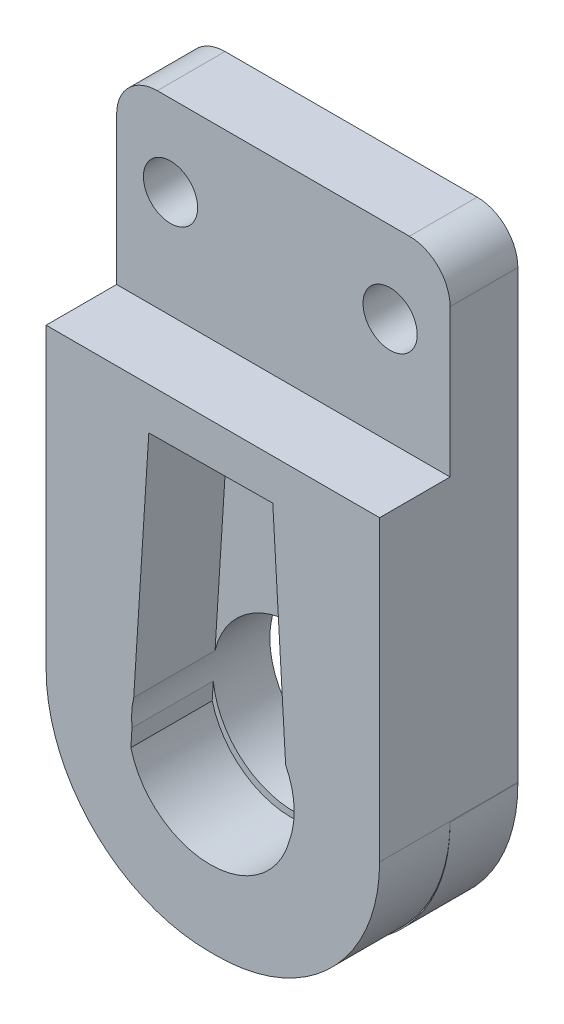
ISO-10303-21;
HEADER;
FILE_DESCRIPTION(('STEP AP214'),'2;1');
FILE_NAME('part.step','',(''),(''),'','','');
FILE_SCHEMA(('AUTOMOTIVE_DESIGN { 1 0 10303 214 1 1 1 1 }'));
ENDSEC;
DATA;
#1=APPLICATION_CONTEXT('core data for automotive mechanical design processes');
#2=APPLICATION_PROTOCOL_DEFINITION('international standard','automotive_design',2000,#1);
#3=PRODUCT_CONTEXT('',#1,'mechanical');
#4=PRODUCT('Part','Part','',(#3));
#5=PRODUCT_RELATED_PRODUCT_CATEGORY('part','',(#4));
#6=PRODUCT_DEFINITION_FORMATION('','',#4);
#7=PRODUCT_DEFINITION_CONTEXT('part definition',#1,'design');
#8=PRODUCT_DEFINITION('design','',#6,#7);
#9=PRODUCT_DEFINITION_SHAPE('','',#8);
#10=(LENGTH_UNIT() NAMED_UNIT(*) SI_UNIT(.MILLI.,.METRE.));
#11=(NAMED_UNIT(*) PLANE_ANGLE_UNIT() SI_UNIT($,.RADIAN.));
#12=(NAMED_UNIT(*) SI_UNIT($,.STERADIAN.) SOLID_ANGLE_UNIT());
#13=UNCERTAINTY_MEASURE_WITH_UNIT(LENGTH_MEASURE(1.E-05),#10,'distance_accuracy_value','');
#14=(GEOMETRIC_REPRESENTATION_CONTEXT(3) GLOBAL_UNCERTAINTY_ASSIGNED_CONTEXT((#13)) GLOBAL_UNIT_ASSIGNED_CONTEXT((#10,
#11,#12)) REPRESENTATION_CONTEXT('',''));
#15=CARTESIAN_POINT('',(0.,0.,0.));
#16=DIRECTION('',(0.,0.,1.));
#17=DIRECTION('',(1.,0.,0.));
#18=AXIS2_PLACEMENT_3D('',#15,#16,#17);
#19=CARTESIAN_POINT('',(0.,0.,12.5));
#20=DIRECTION('',(0.,0.,1.));
#21=DIRECTION('',(1.,0.,0.));
#22=AXIS2_PLACEMENT_3D('',#19,#20,#21);
#23=PLANE('',#22);
#24=DIRECTION('',(-1.,0.,0.));
#25=VECTOR('',#24,1.);
#26=CARTESIAN_POINT('',(-326.037234808109,233.422697823661,12.5));
#27=LINE('',#26,#25);
#28=CARTESIAN_POINT('',(-313.737234808109,233.422697823661,12.5));
#29=VERTEX_POINT('',#28);
#30=CARTESIAN_POINT('',(-326.037234808109,233.422697823661,12.5));
#31=VERTEX_POINT('',#30);
#32=EDGE_CURVE('E248',#29,#31,#27,.T.);
#33=ORIENTED_EDGE('',*,*,#32,.F.);
#34=DIRECTION('',(0.,1.,0.));
#35=VECTOR('',#34,1.);
#36=CARTESIAN_POINT('',(-313.737234808109,240.363656002817,12.5));
#37=LINE('',#36,#35);
#38=CARTESIAN_POINT('',(-313.737234808109,238.863656002817,12.5));
#39=VERTEX_POINT('',#38);
#40=EDGE_CURVE('E300',#29,#39,#37,.T.);
#41=ORIENTED_EDGE('',*,*,#40,.T.);
#42=CARTESIAN_POINT('',(-315.237234808109,238.863656002817,12.5));
#43=DIRECTION('',(0.,0.,1.));
#44=DIRECTION('',(1.,0.,0.));
#45=AXIS2_PLACEMENT_3D('',#42,#43,#44);
#46=CIRCLE('',#45,1.5);
#47=CARTESIAN_POINT('',(-315.237234808109,240.363656002817,12.5));
#48=VERTEX_POINT('',#47);
#49=EDGE_CURVE('E357',#39,#48,#46,.T.);
#50=ORIENTED_EDGE('',*,*,#49,.T.);
#51=DIRECTION('',(-1.,0.,0.));
#52=VECTOR('',#51,1.);
#53=CARTESIAN_POINT('',(-326.037234808109,240.363656002817,12.5));
#54=LINE('',#53,#52);
#55=CARTESIAN_POINT('',(-324.537234808109,240.363656002817,12.5));
#56=VERTEX_POINT('',#55);
#57=EDGE_CURVE('E303',#48,#56,#54,.T.);
#58=ORIENTED_EDGE('',*,*,#57,.T.);
#59=CARTESIAN_POINT('',(-324.537234808109,238.863656002817,12.5));
#60=DIRECTION('',(0.,0.,1.));
#61=DIRECTION('',(1.,0.,0.));
#62=AXIS2_PLACEMENT_3D('',#59,#60,#61);
#63=CIRCLE('',#62,1.5);
#64=CARTESIAN_POINT('',(-326.037234808109,238.863656002817,12.5));
#65=VERTEX_POINT('',#64);
#66=EDGE_CURVE('E360',#56,#65,#63,.T.);
#67=ORIENTED_EDGE('',*,*,#66,.T.);
#68=DIRECTION('',(0.,-1.,0.));
#69=VECTOR('',#68,1.);
#70=CARTESIAN_POINT('',(-326.037234808109,240.363656002817,12.5));
#71=LINE('',#70,#69);
#72=EDGE_CURVE('E293',#65,#31,#71,.T.);
#73=ORIENTED_EDGE('',*,*,#72,.T.);
#74=EDGE_LOOP('',(#33,#41,#50,#58,#67,#73));
#75=FACE_BOUND('',#74,.T.);
#76=CARTESIAN_POINT('',(-324.049090595756,237.363656002817,12.5));
#77=DIRECTION('',(0.,0.,1.));
#78=DIRECTION('',(1.,0.,0.));
#79=AXIS2_PLACEMENT_3D('',#76,#77,#78);
#80=CIRCLE('',#79,0.999999999999998);
#81=CARTESIAN_POINT('',(-323.049090595756,237.363656002817,12.5));
#82=VERTEX_POINT('',#81);
#83=EDGE_CURVE('E285',#82,#82,#80,.T.);
#84=ORIENTED_EDGE('',*,*,#83,.F.);
#85=EDGE_LOOP('',(#84));
#86=FACE_BOUND('',#85,.T.);
#87=CARTESIAN_POINT('',(-315.949090595756,237.363656002817,12.5));
#88=DIRECTION('',(0.,0.,1.));
#89=DIRECTION('',(1.,0.,0.));
#90=AXIS2_PLACEMENT_3D('',#87,#88,#89);
#91=CIRCLE('',#90,0.999999999999998);
#92=CARTESIAN_POINT('',(-314.949090595756,237.363656002817,12.5));
#93=VERTEX_POINT('',#92);
#94=EDGE_CURVE('E284',#93,#93,#91,.T.);
#95=ORIENTED_EDGE('',*,*,#94,.F.);
#96=EDGE_LOOP('',(#95));
#97=FACE_BOUND('',#96,.T.);
#98=ADVANCED_FACE('F41',(#75,#86,#97),#23,.T.);
#99=CARTESIAN_POINT('',(-326.037234808109,240.363656002817,12.5));
#100=DIRECTION('',(1.,0.,0.));
#101=DIRECTION('',(0.,0.,-1.));
#102=AXIS2_PLACEMENT_3D('',#99,#100,#101);
#103=PLANE('',#102);
#104=DIRECTION('',(0.,-1.,0.));
#105=VECTOR('',#104,1.);
#106=CARTESIAN_POINT('',(-326.037234808109,240.363656002817,10.));
#107=LINE('',#106,#105);
#108=CARTESIAN_POINT('',(-326.037234808109,238.863656002817,10.));
#109=VERTEX_POINT('',#108);
#110=CARTESIAN_POINT('',(-326.037234808109,222.422697823661,10.));
#111=VERTEX_POINT('',#110);
#112=EDGE_CURVE('E308',#109,#111,#107,.T.);
#113=ORIENTED_EDGE('',*,*,#112,.T.);
#114=DIRECTION('',(0.,0.,-1.));
#115=VECTOR('',#114,1.);
#116=CARTESIAN_POINT('',(-326.037234808109,222.422697823661,12.5));
#117=LINE('',#116,#115);
#118=CARTESIAN_POINT('',(-326.037234808109,222.422697823661,15.1));
#119=VERTEX_POINT('',#118);
#120=EDGE_CURVE('E399',#111,#119,#117,.F.);
#121=ORIENTED_EDGE('',*,*,#120,.T.);
#122=DIRECTION('',(0.,-1.,0.));
#123=VECTOR('',#122,1.);
#124=CARTESIAN_POINT('',(-326.037234808109,233.422697823661,15.1));
#125=LINE('',#124,#123);
#126=CARTESIAN_POINT('',(-326.037234808109,233.422697823661,15.1));
#127=VERTEX_POINT('',#126);
#128=EDGE_CURVE('E253',#127,#119,#125,.T.);
#129=ORIENTED_EDGE('',*,*,#128,.F.);
#130=DIRECTION('',(0.,0.,-1.));
#131=VECTOR('',#130,1.);
#132=CARTESIAN_POINT('',(-326.037234808109,233.422697823661,15.1));
#133=LINE('',#132,#131);
#134=EDGE_CURVE('E267',#127,#31,#133,.T.);
#135=ORIENTED_EDGE('',*,*,#134,.T.);
#136=ORIENTED_EDGE('',*,*,#72,.F.);
#137=DIRECTION('',(0.,0.,-1.));
#138=VECTOR('',#137,1.);
#139=CARTESIAN_POINT('',(-326.037234808109,238.863656002817,12.5));
#140=LINE('',#139,#138);
#141=EDGE_CURVE('E339',#65,#109,#140,.T.);
#142=ORIENTED_EDGE('',*,*,#141,.T.);
#143=EDGE_LOOP('',(#113,#121,#129,#135,#136,#142));
#144=FACE_BOUND('',#143,.T.);
#145=ADVANCED_FACE('F459',(#144),#103,.F.);
#146=CARTESIAN_POINT('',(-326.037234808109,216.363656002817,12.5));
#147=DIRECTION('',(0.,1.,0.));
#148=DIRECTION('',(0.,0.,1.));
#149=AXIS2_PLACEMENT_3D('',#146,#147,#148);
#150=PLANE('',#149);
#151=DIRECTION('',(1.,0.,0.));
#152=VECTOR('',#151,1.);
#153=CARTESIAN_POINT('',(-326.037234808109,216.363656002817,10.));
#154=LINE('',#153,#152);
#155=CARTESIAN_POINT('',(-320.037234808109,216.363656002817,10.));
#156=VERTEX_POINT('',#155);
#157=CARTESIAN_POINT('',(-319.737234808108,216.363656002817,10.));
#158=VERTEX_POINT('',#157);
#159=EDGE_CURVE('E312',#156,#158,#154,.T.);
#160=ORIENTED_EDGE('',*,*,#159,.T.);
#161=DIRECTION('',(0.,0.,-1.));
#162=VECTOR('',#161,1.);
#163=CARTESIAN_POINT('',(-319.737234808108,216.363656002817,12.5));
#164=LINE('',#163,#162);
#165=CARTESIAN_POINT('',(-319.737234808108,216.363656002817,12.5));
#166=VERTEX_POINT('',#165);
#167=EDGE_CURVE('E332',#158,#166,#164,.F.);
#168=ORIENTED_EDGE('',*,*,#167,.T.);
#169=DIRECTION('',(1.,0.,0.));
#170=VECTOR('',#169,1.);
#171=CARTESIAN_POINT('',(-326.037234808109,216.363656002817,12.5));
#172=LINE('',#171,#170);
#173=CARTESIAN_POINT('',(-320.037234808109,216.363656002817,12.5));
#174=VERTEX_POINT('',#173);
#175=EDGE_CURVE('E296',#174,#166,#172,.T.);
#176=ORIENTED_EDGE('',*,*,#175,.F.);
#177=DIRECTION('',(0.,0.,-1.));
#178=VECTOR('',#177,1.);
#179=CARTESIAN_POINT('',(-320.037234808109,216.363656002817,12.5));
#180=LINE('',#179,#178);
#181=EDGE_CURVE('E328',#174,#156,#180,.T.);
#182=ORIENTED_EDGE('',*,*,#181,.T.);
#183=EDGE_LOOP('',(#160,#168,#176,#182));
#184=FACE_BOUND('',#183,.T.);
#185=ADVANCED_FACE('F440',(#184),#150,.F.);
#186=CARTESIAN_POINT('',(-313.737234808109,240.363656002817,12.5));
#187=DIRECTION('',(-1.,0.,0.));
#188=DIRECTION('',(0.,-1.,0.));
#189=AXIS2_PLACEMENT_3D('',#186,#187,#188);
#190=PLANE('',#189);
#191=DIRECTION('',(0.,1.,0.));
#192=VECTOR('',#191,1.);
#193=CARTESIAN_POINT('',(-313.737234808109,233.422697823661,15.1));
#194=LINE('',#193,#192);
#195=CARTESIAN_POINT('',(-313.737234808109,222.422697823661,15.1));
#196=VERTEX_POINT('',#195);
#197=CARTESIAN_POINT('',(-313.737234808109,233.422697823661,15.1));
#198=VERTEX_POINT('',#197);
#199=EDGE_CURVE('E261',#196,#198,#194,.T.);
#200=ORIENTED_EDGE('',*,*,#199,.F.);
#201=DIRECTION('',(0.,0.,-1.));
#202=VECTOR('',#201,1.);
#203=CARTESIAN_POINT('',(-313.737234808108,222.422697823661,12.5));
#204=LINE('',#203,#202);
#205=CARTESIAN_POINT('',(-313.737234808108,222.422697823661,10.));
#206=VERTEX_POINT('',#205);
#207=EDGE_CURVE('E408',#196,#206,#204,.T.);
#208=ORIENTED_EDGE('',*,*,#207,.T.);
#209=DIRECTION('',(0.,1.,0.));
#210=VECTOR('',#209,1.);
#211=CARTESIAN_POINT('',(-313.737234808109,240.363656002817,10.));
#212=LINE('',#211,#210);
#213=CARTESIAN_POINT('',(-313.737234808109,238.863656002817,10.));
#214=VERTEX_POINT('',#213);
#215=EDGE_CURVE('E317',#206,#214,#212,.T.);
#216=ORIENTED_EDGE('',*,*,#215,.T.);
#217=DIRECTION('',(0.,0.,-1.));
#218=VECTOR('',#217,1.);
#219=CARTESIAN_POINT('',(-313.737234808109,238.863656002817,12.5));
#220=LINE('',#219,#218);
#221=EDGE_CURVE('E273',#214,#39,#220,.F.);
#222=ORIENTED_EDGE('',*,*,#221,.T.);
#223=ORIENTED_EDGE('',*,*,#40,.F.);
#224=DIRECTION('',(0.,0.,-1.));
#225=VECTOR('',#224,1.);
#226=CARTESIAN_POINT('',(-313.737234808109,233.422697823661,15.1));
#227=LINE('',#226,#225);
#228=EDGE_CURVE('E280',#198,#29,#227,.T.);
#229=ORIENTED_EDGE('',*,*,#228,.F.);
#230=EDGE_LOOP('',(#200,#208,#216,#222,#223,#229));
#231=FACE_BOUND('',#230,.T.);
#232=ADVANCED_FACE('F450',(#231),#190,.F.);
#233=CARTESIAN_POINT('',(-326.037234808109,240.363656002817,12.5));
#234=DIRECTION('',(0.,-1.,0.));
#235=DIRECTION('',(0.,0.,-1.));
#236=AXIS2_PLACEMENT_3D('',#233,#234,#235);
#237=PLANE('',#236);
#238=DIRECTION('',(-1.,0.,0.));
#239=VECTOR('',#238,1.);
#240=CARTESIAN_POINT('',(-326.037234808109,240.363656002817,10.));
#241=LINE('',#240,#239);
#242=CARTESIAN_POINT('',(-315.237234808109,240.363656002817,10.));
#243=VERTEX_POINT('',#242);
#244=CARTESIAN_POINT('',(-324.537234808109,240.363656002817,10.));
#245=VERTEX_POINT('',#244);
#246=EDGE_CURVE('E297',#243,#245,#241,.T.);
#247=ORIENTED_EDGE('',*,*,#246,.T.);
#248=DIRECTION('',(0.,0.,-1.));
#249=VECTOR('',#248,1.);
#250=CARTESIAN_POINT('',(-324.537234808109,240.363656002817,12.5));
#251=LINE('',#250,#249);
#252=EDGE_CURVE('E354',#245,#56,#251,.F.);
#253=ORIENTED_EDGE('',*,*,#252,.T.);
#254=ORIENTED_EDGE('',*,*,#57,.F.);
#255=DIRECTION('',(0.,0.,-1.));
#256=VECTOR('',#255,1.);
#257=CARTESIAN_POINT('',(-315.237234808109,240.363656002817,12.5));
#258=LINE('',#257,#256);
#259=EDGE_CURVE('E350',#48,#243,#258,.T.);
#260=ORIENTED_EDGE('',*,*,#259,.T.);
#261=EDGE_LOOP('',(#247,#253,#254,#260));
#262=FACE_BOUND('',#261,.T.);
#263=ADVANCED_FACE('F466',(#262),#237,.F.);
#264=DIRECTION('',(1.,0.,0.));
#265=VECTOR('',#264,1.);
#266=CARTESIAN_POINT('',(-326.037234808109,216.422697823661,12.5));
#267=LINE('',#266,#265);
#268=CARTESIAN_POINT('',(-320.037234808109,216.422697823661,12.5));
#269=VERTEX_POINT('',#268);
#270=CARTESIAN_POINT('',(-319.737234808108,216.422697823661,12.5));
#271=VERTEX_POINT('',#270);
#272=EDGE_CURVE('E268',#269,#271,#267,.T.);
#273=ORIENTED_EDGE('',*,*,#272,.F.);
#274=CARTESIAN_POINT('',(-320.037234808109,222.422697823661,12.5));
#275=DIRECTION('',(0.,0.,1.));
#276=DIRECTION('',(1.,0.,0.));
#277=AXIS2_PLACEMENT_3D('',#274,#275,#276);
#278=CIRCLE('',#277,6.);
#279=CARTESIAN_POINT('',(-326.03716218399,222.393176913239,12.5));
#280=VERTEX_POINT('',#279);
#281=EDGE_CURVE('E412',#269,#280,#278,.F.);
#282=ORIENTED_EDGE('',*,*,#281,.T.);
#283=CARTESIAN_POINT('',(-320.037234808109,222.363656002817,12.5));
#284=DIRECTION('',(0.,0.,1.));
#285=DIRECTION('',(1.,0.,0.));
#286=AXIS2_PLACEMENT_3D('',#283,#284,#285);
#287=CIRCLE('',#286,6.);
#288=EDGE_CURVE('E64',#280,#174,#287,.T.);
#289=ORIENTED_EDGE('',*,*,#288,.T.);
#290=ORIENTED_EDGE('',*,*,#175,.T.);
#291=CARTESIAN_POINT('',(-319.737234808108,222.363656002817,12.5));
#292=DIRECTION('',(0.,0.,1.));
#293=DIRECTION('',(1.,0.,0.));
#294=AXIS2_PLACEMENT_3D('',#291,#292,#293);
#295=CIRCLE('',#294,6.);
#296=CARTESIAN_POINT('',(-313.737307432227,222.393176913239,12.5));
#297=VERTEX_POINT('',#296);
#298=EDGE_CURVE('E56',#166,#297,#295,.T.);
#299=ORIENTED_EDGE('',*,*,#298,.T.);
#300=CARTESIAN_POINT('',(-319.737234808108,222.422697823661,12.5));
#301=DIRECTION('',(0.,0.,1.));
#302=DIRECTION('',(1.,0.,0.));
#303=AXIS2_PLACEMENT_3D('',#300,#301,#302);
#304=CIRCLE('',#303,6.);
#305=EDGE_CURVE('E11',#297,#271,#304,.F.);
#306=ORIENTED_EDGE('',*,*,#305,.T.);
#307=EDGE_LOOP('',(#273,#282,#289,#290,#299,#306));
#308=FACE_BOUND('',#307,.T.);
#309=ADVANCED_FACE('F427',(#308),#23,.T.);
#310=CARTESIAN_POINT('',(0.,0.,10.));
#311=DIRECTION('',(0.,0.,1.));
#312=DIRECTION('',(1.,0.,0.));
#313=AXIS2_PLACEMENT_3D('',#310,#311,#312);
#314=PLANE('',#313);
#315=CARTESIAN_POINT('',(-319.887234808109,222.453892898563,10.));
#316=DIRECTION('',(0.,0.,1.));
#317=DIRECTION('',(1.,0.,0.));
#318=AXIS2_PLACEMENT_3D('',#315,#316,#317);
#319=CIRCLE('',#318,2.99999999999999);
#320=CARTESIAN_POINT('',(-316.887234808109,222.453892898563,10.));
#321=VERTEX_POINT('',#320);
#322=EDGE_CURVE('E244',#321,#321,#319,.T.);
#323=ORIENTED_EDGE('',*,*,#322,.T.);
#324=EDGE_LOOP('',(#323));
#325=FACE_BOUND('',#324,.T.);
#326=CARTESIAN_POINT('',(-324.049090595756,237.363656002817,10.));
#327=DIRECTION('',(0.,0.,1.));
#328=DIRECTION('',(1.,0.,0.));
#329=AXIS2_PLACEMENT_3D('',#326,#327,#328);
#330=CIRCLE('',#329,0.999999999999998);
#331=CARTESIAN_POINT('',(-323.049090595756,237.363656002817,10.));
#332=VERTEX_POINT('',#331);
#333=EDGE_CURVE('E313',#332,#332,#330,.T.);
#334=ORIENTED_EDGE('',*,*,#333,.T.);
#335=EDGE_LOOP('',(#334));
#336=FACE_BOUND('',#335,.T.);
#337=CARTESIAN_POINT('',(-315.949090595756,237.363656002817,10.));
#338=DIRECTION('',(0.,0.,1.));
#339=DIRECTION('',(1.,0.,0.));
#340=AXIS2_PLACEMENT_3D('',#337,#338,#339);
#341=CIRCLE('',#340,0.999999999999998);
#342=CARTESIAN_POINT('',(-314.949090595756,237.363656002817,10.));
#343=VERTEX_POINT('',#342);
#344=EDGE_CURVE('E289',#343,#343,#341,.T.);
#345=ORIENTED_EDGE('',*,*,#344,.T.);
#346=EDGE_LOOP('',(#345));
#347=FACE_BOUND('',#346,.T.);
#348=CARTESIAN_POINT('',(-320.037234808109,222.363656002817,10.));
#349=DIRECTION('',(0.,0.,1.));
#350=DIRECTION('',(1.,0.,0.));
#351=AXIS2_PLACEMENT_3D('',#348,#349,#350);
#352=CIRCLE('',#351,6.);
#353=CARTESIAN_POINT('',(-326.03716218399,222.393176913239,10.));
#354=VERTEX_POINT('',#353);
#355=EDGE_CURVE('E307',#156,#354,#352,.F.);
#356=ORIENTED_EDGE('',*,*,#355,.T.);
#357=CARTESIAN_POINT('',(-320.037234808109,222.422697823661,10.));
#358=DIRECTION('',(0.,0.,1.));
#359=DIRECTION('',(1.,0.,0.));
#360=AXIS2_PLACEMENT_3D('',#357,#358,#359);
#361=CIRCLE('',#360,6.);
#362=EDGE_CURVE('E396',#354,#111,#361,.F.);
#363=ORIENTED_EDGE('',*,*,#362,.T.);
#364=ORIENTED_EDGE('',*,*,#112,.F.);
#365=CARTESIAN_POINT('',(-324.537234808109,238.863656002817,10.));
#366=DIRECTION('',(0.,0.,1.));
#367=DIRECTION('',(1.,0.,0.));
#368=AXIS2_PLACEMENT_3D('',#365,#366,#367);
#369=CIRCLE('',#368,1.5);
#370=EDGE_CURVE('E347',#109,#245,#369,.F.);
#371=ORIENTED_EDGE('',*,*,#370,.T.);
#372=ORIENTED_EDGE('',*,*,#246,.F.);
#373=CARTESIAN_POINT('',(-315.237234808109,238.863656002817,10.));
#374=DIRECTION('',(0.,0.,1.));
#375=DIRECTION('',(1.,0.,0.));
#376=AXIS2_PLACEMENT_3D('',#373,#374,#375);
#377=CIRCLE('',#376,1.5);
#378=EDGE_CURVE('E343',#243,#214,#377,.F.);
#379=ORIENTED_EDGE('',*,*,#378,.T.);
#380=ORIENTED_EDGE('',*,*,#215,.F.);
#381=CARTESIAN_POINT('',(-319.737234808108,222.422697823661,10.));
#382=DIRECTION('',(0.,0.,1.));
#383=DIRECTION('',(1.,0.,0.));
#384=AXIS2_PLACEMENT_3D('',#381,#382,#383);
#385=CIRCLE('',#384,6.);
#386=CARTESIAN_POINT('',(-313.737307432227,222.393176913239,10.));
#387=VERTEX_POINT('',#386);
#388=EDGE_CURVE('E392',#206,#387,#385,.F.);
#389=ORIENTED_EDGE('',*,*,#388,.T.);
#390=CARTESIAN_POINT('',(-319.737234808108,222.363656002817,10.));
#391=DIRECTION('',(0.,0.,1.));
#392=DIRECTION('',(1.,0.,0.));
#393=AXIS2_PLACEMENT_3D('',#390,#391,#392);
#394=CIRCLE('',#393,6.);
#395=EDGE_CURVE('E325',#387,#158,#394,.F.);
#396=ORIENTED_EDGE('',*,*,#395,.T.);
#397=ORIENTED_EDGE('',*,*,#159,.F.);
#398=EDGE_LOOP('',(#356,#363,#364,#371,#372,#379,#380,#389,#396,#397));
#399=FACE_BOUND('',#398,.T.);
#400=ADVANCED_FACE('F444',(#325,#336,#347,#399),#314,.F.);
#401=CARTESIAN_POINT('',(-319.737234808108,222.363656002817,12.5));
#402=DIRECTION('',(0.,0.,-1.));
#403=DIRECTION('',(-1.,0.,0.));
#404=AXIS2_PLACEMENT_3D('',#401,#402,#403);
#405=CYLINDRICAL_SURFACE('',#404,6.);
#406=ORIENTED_EDGE('',*,*,#298,.F.);
#407=ORIENTED_EDGE('',*,*,#167,.F.);
#408=ORIENTED_EDGE('',*,*,#395,.F.);
#409=DIRECTION('',(0.,0.,-1.));
#410=VECTOR('',#409,1.);
#411=CARTESIAN_POINT('',(-313.737307432227,222.393176913239,10.));
#412=LINE('',#411,#410);
#413=EDGE_CURVE('E50',#387,#297,#412,.F.);
#414=ORIENTED_EDGE('',*,*,#413,.T.);
#415=EDGE_LOOP('',(#406,#407,#408,#414));
#416=FACE_BOUND('',#415,.T.);
#417=ADVANCED_FACE('F421',(#416),#405,.T.);
#418=CARTESIAN_POINT('',(-320.037234808109,222.363656002817,12.5));
#419=DIRECTION('',(0.,0.,-1.));
#420=DIRECTION('',(-1.,0.,0.));
#421=AXIS2_PLACEMENT_3D('',#418,#419,#420);
#422=CYLINDRICAL_SURFACE('',#421,6.);
#423=ORIENTED_EDGE('',*,*,#288,.F.);
#424=DIRECTION('',(0.,0.,-1.));
#425=VECTOR('',#424,1.);
#426=CARTESIAN_POINT('',(-326.03716218399,222.393176913239,12.5));
#427=LINE('',#426,#425);
#428=EDGE_CURVE('E415',#280,#354,#427,.T.);
#429=ORIENTED_EDGE('',*,*,#428,.T.);
#430=ORIENTED_EDGE('',*,*,#355,.F.);
#431=ORIENTED_EDGE('',*,*,#181,.F.);
#432=EDGE_LOOP('',(#423,#429,#430,#431));
#433=FACE_BOUND('',#432,.T.);
#434=ADVANCED_FACE('F442',(#433),#422,.T.);
#435=CARTESIAN_POINT('',(-324.537234808109,238.863656002817,12.5));
#436=DIRECTION('',(0.,0.,-1.));
#437=DIRECTION('',(-1.,0.,0.));
#438=AXIS2_PLACEMENT_3D('',#435,#436,#437);
#439=CYLINDRICAL_SURFACE('',#438,1.5);
#440=ORIENTED_EDGE('',*,*,#66,.F.);
#441=ORIENTED_EDGE('',*,*,#252,.F.);
#442=ORIENTED_EDGE('',*,*,#370,.F.);
#443=ORIENTED_EDGE('',*,*,#141,.F.);
#444=EDGE_LOOP('',(#440,#441,#442,#443));
#445=FACE_BOUND('',#444,.T.);
#446=ADVANCED_FACE('F470',(#445),#439,.T.);
#447=CARTESIAN_POINT('',(-315.237234808109,238.863656002817,12.5));
#448=DIRECTION('',(0.,0.,-1.));
#449=DIRECTION('',(-1.,0.,0.));
#450=AXIS2_PLACEMENT_3D('',#447,#448,#449);
#451=CYLINDRICAL_SURFACE('',#450,1.5);
#452=ORIENTED_EDGE('',*,*,#49,.F.);
#453=ORIENTED_EDGE('',*,*,#221,.F.);
#454=ORIENTED_EDGE('',*,*,#378,.F.);
#455=ORIENTED_EDGE('',*,*,#259,.F.);
#456=EDGE_LOOP('',(#452,#453,#454,#455));
#457=FACE_BOUND('',#456,.T.);
#458=ADVANCED_FACE('F475',(#457),#451,.T.);
#459=CARTESIAN_POINT('',(-315.949090595756,237.363656002817,9.));
#460=DIRECTION('',(0.,0.,1.));
#461=DIRECTION('',(1.,0.,0.));
#462=AXIS2_PLACEMENT_3D('',#459,#460,#461);
#463=CYLINDRICAL_SURFACE('',#462,0.999999999999998);
#464=ORIENTED_EDGE('',*,*,#94,.T.);
#465=EDGE_LOOP('',(#464));
#466=FACE_BOUND('',#465,.T.);
#467=ORIENTED_EDGE('',*,*,#344,.F.);
#468=EDGE_LOOP('',(#467));
#469=FACE_BOUND('',#468,.T.);
#470=ADVANCED_FACE('F519',(#466,#469),#463,.F.);
#471=CARTESIAN_POINT('',(-324.049090595756,237.363656002817,9.));
#472=DIRECTION('',(0.,0.,1.));
#473=DIRECTION('',(1.,0.,0.));
#474=AXIS2_PLACEMENT_3D('',#471,#472,#473);
#475=CYLINDRICAL_SURFACE('',#474,0.999999999999998);
#476=ORIENTED_EDGE('',*,*,#83,.T.);
#477=EDGE_LOOP('',(#476));
#478=FACE_BOUND('',#477,.T.);
#479=ORIENTED_EDGE('',*,*,#333,.F.);
#480=EDGE_LOOP('',(#479));
#481=FACE_BOUND('',#480,.T.);
#482=ADVANCED_FACE('F488',(#478,#481),#475,.F.);
#483=CARTESIAN_POINT('',(-326.037234808109,216.422697823661,15.1));
#484=DIRECTION('',(0.,1.,0.));
#485=DIRECTION('',(0.,0.,1.));
#486=AXIS2_PLACEMENT_3D('',#483,#484,#485);
#487=PLANE('',#486);
#488=DIRECTION('',(1.,0.,0.));
#489=VECTOR('',#488,1.);
#490=CARTESIAN_POINT('',(-326.037234808109,216.422697823661,15.1));
#491=LINE('',#490,#489);
#492=CARTESIAN_POINT('',(-320.037234808109,216.422697823661,15.1));
#493=VERTEX_POINT('',#492);
#494=CARTESIAN_POINT('',(-319.737234808108,216.422697823661,15.1));
#495=VERTEX_POINT('',#494);
#496=EDGE_CURVE('E257',#493,#495,#491,.T.);
#497=ORIENTED_EDGE('',*,*,#496,.F.);
#498=DIRECTION('',(0.,0.,-1.));
#499=VECTOR('',#498,1.);
#500=CARTESIAN_POINT('',(-320.037234808109,216.422697823661,15.1));
#501=LINE('',#500,#499);
#502=EDGE_CURVE('E388',#493,#269,#501,.T.);
#503=ORIENTED_EDGE('',*,*,#502,.T.);
#504=ORIENTED_EDGE('',*,*,#272,.T.);
#505=DIRECTION('',(0.,0.,-1.));
#506=VECTOR('',#505,1.);
#507=CARTESIAN_POINT('',(-319.737234808108,216.422697823661,15.1));
#508=LINE('',#507,#506);
#509=EDGE_CURVE('E385',#271,#495,#508,.F.);
#510=ORIENTED_EDGE('',*,*,#509,.T.);
#511=EDGE_LOOP('',(#497,#503,#504,#510));
#512=FACE_BOUND('',#511,.T.);
#513=ADVANCED_FACE('F430',(#512),#487,.F.);
#514=CARTESIAN_POINT('',(-326.037234808109,233.422697823661,15.1));
#515=DIRECTION('',(0.,-1.,0.));
#516=DIRECTION('',(0.,0.,-1.));
#517=AXIS2_PLACEMENT_3D('',#514,#515,#516);
#518=PLANE('',#517);
#519=ORIENTED_EDGE('',*,*,#32,.T.);
#520=ORIENTED_EDGE('',*,*,#134,.F.);
#521=DIRECTION('',(-1.,0.,0.));
#522=VECTOR('',#521,1.);
#523=CARTESIAN_POINT('',(-326.037234808109,233.422697823661,15.1));
#524=LINE('',#523,#522);
#525=EDGE_CURVE('E264',#198,#127,#524,.T.);
#526=ORIENTED_EDGE('',*,*,#525,.F.);
#527=ORIENTED_EDGE('',*,*,#228,.T.);
#528=EDGE_LOOP('',(#519,#520,#526,#527));
#529=FACE_BOUND('',#528,.T.);
#530=ADVANCED_FACE('F478',(#529),#518,.F.);
#531=CARTESIAN_POINT('',(0.,0.,15.1));
#532=DIRECTION('',(0.,0.,1.));
#533=DIRECTION('',(1.,0.,0.));
#534=AXIS2_PLACEMENT_3D('',#531,#532,#533);
#535=PLANE('',#534);
#536=DIRECTION('',(-0.0635567328012028,-0.997978227074938,0.));
#537=VECTOR('',#536,1.);
#538=CARTESIAN_POINT('',(-322.250902379928,231.875277786352,15.1));
#539=LINE('',#538,#537);
#540=CARTESIAN_POINT('',(-322.250902379928,231.875277786352,15.1));
#541=VERTEX_POINT('',#540);
#542=CARTESIAN_POINT('',(-322.80702332475,223.142975635316,15.1));
#543=VERTEX_POINT('',#542);
#544=EDGE_CURVE('E222',#541,#543,#539,.T.);
#545=ORIENTED_EDGE('',*,*,#544,.F.);
#546=DIRECTION('',(-0.999960008988507,-0.00894317749484569,0.));
#547=VECTOR('',#546,1.);
#548=CARTESIAN_POINT('',(-322.250902379928,231.875277786352,15.1));
#549=LINE('',#548,#547);
#550=CARTESIAN_POINT('',(-317.677584193386,231.916179418332,15.1));
#551=VERTEX_POINT('',#550);
#552=EDGE_CURVE('E197',#551,#541,#549,.T.);
#553=ORIENTED_EDGE('',*,*,#552,.F.);
#554=DIRECTION('',(-0.0582732361136196,0.998300671117097,0.));
#555=VECTOR('',#554,1.);
#556=CARTESIAN_POINT('',(-317.677584193386,231.916179418332,15.1));
#557=LINE('',#556,#555);
#558=CARTESIAN_POINT('',(-317.203510680958,223.794648211567,15.1));
#559=VERTEX_POINT('',#558);
#560=EDGE_CURVE('E228',#559,#551,#557,.T.);
#561=ORIENTED_EDGE('',*,*,#560,.F.);
#562=CARTESIAN_POINT('',(-319.887234808109,222.453892898563,15.1));
#563=DIRECTION('',(0.,0.,1.));
#564=DIRECTION('',(1.,0.,0.));
#565=AXIS2_PLACEMENT_3D('',#562,#563,#564);
#566=CIRCLE('',#565,2.99999999999999);
#567=CARTESIAN_POINT('',(-317.065742536763,221.434490444801,15.1));
#568=VERTEX_POINT('',#567);
#569=EDGE_CURVE('E237',#568,#559,#566,.T.);
#570=ORIENTED_EDGE('',*,*,#569,.F.);
#571=CARTESIAN_POINT('',(-319.981908384294,222.241853291077,15.1));
#572=DIRECTION('',(0.,0.,1.));
#573=DIRECTION('',(1.,0.,0.));
#574=AXIS2_PLACEMENT_3D('',#571,#572,#573);
#575=CIRCLE('',#574,3.02586483767132);
#576=CARTESIAN_POINT('',(-322.912409662887,221.488182094851,15.1));
#577=VERTEX_POINT('',#576);
#578=EDGE_CURVE('E225',#577,#568,#575,.T.);
#579=ORIENTED_EDGE('',*,*,#578,.F.);
#580=CARTESIAN_POINT('',(-322.870849201164,222.140771271151,15.1));
#581=VERTEX_POINT('',#580);
#582=EDGE_CURVE('E203',#581,#577,#539,.T.);
#583=ORIENTED_EDGE('',*,*,#582,.F.);
#584=EDGE_CURVE('E249',#543,#581,#566,.T.);
#585=ORIENTED_EDGE('',*,*,#584,.F.);
#586=EDGE_LOOP('',(#545,#553,#561,#570,#579,#583,#585));
#587=FACE_BOUND('',#586,.T.);
#588=ORIENTED_EDGE('',*,*,#128,.T.);
#589=CARTESIAN_POINT('',(-320.037234808109,222.422697823661,15.1));
#590=DIRECTION('',(0.,0.,1.));
#591=DIRECTION('',(1.,0.,0.));
#592=AXIS2_PLACEMENT_3D('',#589,#590,#591);
#593=CIRCLE('',#592,6.);
#594=EDGE_CURVE('E405',#119,#493,#593,.T.);
#595=ORIENTED_EDGE('',*,*,#594,.T.);
#596=ORIENTED_EDGE('',*,*,#496,.T.);
#597=CARTESIAN_POINT('',(-319.737234808108,222.422697823661,15.1));
#598=DIRECTION('',(0.,0.,1.));
#599=DIRECTION('',(1.,0.,0.));
#600=AXIS2_PLACEMENT_3D('',#597,#598,#599);
#601=CIRCLE('',#600,6.);
#602=EDGE_CURVE('E402',#495,#196,#601,.T.);
#603=ORIENTED_EDGE('',*,*,#602,.T.);
#604=ORIENTED_EDGE('',*,*,#199,.T.);
#605=ORIENTED_EDGE('',*,*,#525,.T.);
#606=EDGE_LOOP('',(#588,#595,#596,#603,#604,#605));
#607=FACE_BOUND('',#606,.T.);
#608=ADVANCED_FACE('F455',(#587,#607),#535,.T.);
#609=CARTESIAN_POINT('',(-319.887234808109,222.453892898563,10.));
#610=DIRECTION('',(0.,0.,1.));
#611=DIRECTION('',(1.,0.,0.));
#612=AXIS2_PLACEMENT_3D('',#609,#610,#611);
#613=CYLINDRICAL_SURFACE('',#612,2.99999999999999);
#614=ORIENTED_EDGE('',*,*,#584,.T.);
#615=DIRECTION('',(0.,0.,1.));
#616=VECTOR('',#615,1.);
#617=CARTESIAN_POINT('',(-322.870849201164,222.140771271151,10.));
#618=LINE('',#617,#616);
#619=CARTESIAN_POINT('',(-322.870849201164,222.140771271151,12.1));
#620=VERTEX_POINT('',#619);
#621=EDGE_CURVE('E382',#581,#620,#618,.F.);
#622=ORIENTED_EDGE('',*,*,#621,.T.);
#623=CARTESIAN_POINT('',(-319.887234808109,222.453892898563,12.1));
#624=DIRECTION('',(0.,0.,1.));
#625=DIRECTION('',(1.,0.,0.));
#626=AXIS2_PLACEMENT_3D('',#623,#624,#625);
#627=CIRCLE('',#626,2.99999999999999);
#628=CARTESIAN_POINT('',(-317.065742536763,221.434490444801,12.1));
#629=VERTEX_POINT('',#628);
#630=EDGE_CURVE('E192',#629,#620,#627,.F.);
#631=ORIENTED_EDGE('',*,*,#630,.F.);
#632=DIRECTION('',(0.,0.,1.));
#633=VECTOR('',#632,1.);
#634=CARTESIAN_POINT('',(-317.065742536763,221.434490444801,12.1));
#635=LINE('',#634,#633);
#636=EDGE_CURVE('E207',#629,#568,#635,.T.);
#637=ORIENTED_EDGE('',*,*,#636,.T.);
#638=ORIENTED_EDGE('',*,*,#569,.T.);
#639=DIRECTION('',(0.,0.,1.));
#640=VECTOR('',#639,1.);
#641=CARTESIAN_POINT('',(-317.203510680958,223.794648211567,10.));
#642=LINE('',#641,#640);
#643=CARTESIAN_POINT('',(-317.203510680958,223.794648211567,12.1));
#644=VERTEX_POINT('',#643);
#645=EDGE_CURVE('E374',#559,#644,#642,.F.);
#646=ORIENTED_EDGE('',*,*,#645,.T.);
#647=CARTESIAN_POINT('',(-322.80702332475,223.142975635316,12.1));
#648=VERTEX_POINT('',#647);
#649=EDGE_CURVE('E272',#648,#644,#627,.F.);
#650=ORIENTED_EDGE('',*,*,#649,.F.);
#651=DIRECTION('',(0.,0.,1.));
#652=VECTOR('',#651,1.);
#653=CARTESIAN_POINT('',(-322.80702332475,223.142975635316,10.));
#654=LINE('',#653,#652);
#655=EDGE_CURVE('E378',#648,#543,#654,.T.);
#656=ORIENTED_EDGE('',*,*,#655,.T.);
#657=EDGE_LOOP('',(#614,#622,#631,#637,#638,#646,#650,#656));
#658=FACE_BOUND('',#657,.T.);
#659=ORIENTED_EDGE('',*,*,#322,.F.);
#660=EDGE_LOOP('',(#659));
#661=FACE_BOUND('',#660,.T.);
#662=ADVANCED_FACE('F485',(#658,#661),#613,.F.);
#663=CARTESIAN_POINT('',(-319.981908384294,222.241853291077,12.1));
#664=DIRECTION('',(0.,0.,1.));
#665=DIRECTION('',(1.,0.,0.));
#666=AXIS2_PLACEMENT_3D('',#663,#664,#665);
#667=PLANE('',#666);
#668=ORIENTED_EDGE('',*,*,#649,.T.);
#669=DIRECTION('',(-0.0582732361136196,0.998300671117097,0.));
#670=VECTOR('',#669,1.);
#671=CARTESIAN_POINT('',(-317.677584193386,231.916179418332,12.1));
#672=LINE('',#671,#670);
#673=CARTESIAN_POINT('',(-317.677584193386,231.916179418332,12.1));
#674=VERTEX_POINT('',#673);
#675=EDGE_CURVE('E213',#644,#674,#672,.T.);
#676=ORIENTED_EDGE('',*,*,#675,.T.);
#677=DIRECTION('',(-0.999960008988507,-0.00894317749484569,0.));
#678=VECTOR('',#677,1.);
#679=CARTESIAN_POINT('',(-322.250902379928,231.875277786352,12.1));
#680=LINE('',#679,#678);
#681=CARTESIAN_POINT('',(-322.250902379928,231.875277786352,12.1));
#682=VERTEX_POINT('',#681);
#683=EDGE_CURVE('E208',#674,#682,#680,.T.);
#684=ORIENTED_EDGE('',*,*,#683,.T.);
#685=DIRECTION('',(-0.0635567328012028,-0.997978227074938,0.));
#686=VECTOR('',#685,1.);
#687=CARTESIAN_POINT('',(-322.250902379928,231.875277786352,12.1));
#688=LINE('',#687,#686);
#689=EDGE_CURVE('E196',#682,#648,#688,.T.);
#690=ORIENTED_EDGE('',*,*,#689,.T.);
#691=EDGE_LOOP('',(#668,#676,#684,#690));
#692=FACE_BOUND('',#691,.T.);
#693=ADVANCED_FACE('F530',(#692),#667,.T.);
#694=CARTESIAN_POINT('',(-317.677584193386,231.916179418332,12.1));
#695=DIRECTION('',(0.998300671117097,0.0582732361136196,0.));
#696=DIRECTION('',(-0.0582732361136196,0.998300671117097,0.));
#697=AXIS2_PLACEMENT_3D('',#694,#695,#696);
#698=PLANE('',#697);
#699=ORIENTED_EDGE('',*,*,#560,.T.);
#700=DIRECTION('',(0.,0.,1.));
#701=VECTOR('',#700,1.);
#702=CARTESIAN_POINT('',(-317.677584193386,231.916179418332,12.1));
#703=LINE('',#702,#701);
#704=EDGE_CURVE('E238',#674,#551,#703,.T.);
#705=ORIENTED_EDGE('',*,*,#704,.F.);
#706=ORIENTED_EDGE('',*,*,#675,.F.);
#707=ORIENTED_EDGE('',*,*,#645,.F.);
#708=EDGE_LOOP('',(#699,#705,#706,#707));
#709=FACE_BOUND('',#708,.T.);
#710=ADVANCED_FACE('F533',(#709),#698,.F.);
#711=CARTESIAN_POINT('',(-322.250902379928,231.875277786352,12.1));
#712=DIRECTION('',(-0.997978227074938,0.0635567328012028,0.));
#713=DIRECTION('',(-0.0635567328012028,-0.997978227074938,0.));
#714=AXIS2_PLACEMENT_3D('',#711,#712,#713);
#715=PLANE('',#714);
#716=ORIENTED_EDGE('',*,*,#689,.F.);
#717=DIRECTION('',(0.,0.,1.));
#718=VECTOR('',#717,1.);
#719=CARTESIAN_POINT('',(-322.250902379928,231.875277786352,12.1));
#720=LINE('',#719,#718);
#721=EDGE_CURVE('E234',#682,#541,#720,.T.);
#722=ORIENTED_EDGE('',*,*,#721,.T.);
#723=ORIENTED_EDGE('',*,*,#544,.T.);
#724=ORIENTED_EDGE('',*,*,#655,.F.);
#725=EDGE_LOOP('',(#716,#722,#723,#724));
#726=FACE_BOUND('',#725,.T.);
#727=ADVANCED_FACE('F538',(#726),#715,.F.);
#728=CARTESIAN_POINT('',(-322.250902379928,231.875277786352,12.1));
#729=DIRECTION('',(-0.00894317749484569,0.999960008988507,0.));
#730=DIRECTION('',(-0.999960008988507,-0.00894317749484569,0.));
#731=AXIS2_PLACEMENT_3D('',#728,#729,#730);
#732=PLANE('',#731);
#733=ORIENTED_EDGE('',*,*,#552,.T.);
#734=ORIENTED_EDGE('',*,*,#721,.F.);
#735=ORIENTED_EDGE('',*,*,#683,.F.);
#736=ORIENTED_EDGE('',*,*,#704,.T.);
#737=EDGE_LOOP('',(#733,#734,#735,#736));
#738=FACE_BOUND('',#737,.T.);
#739=ADVANCED_FACE('F537',(#738),#732,.F.);
#740=ORIENTED_EDGE('',*,*,#582,.T.);
#741=DIRECTION('',(0.,0.,1.));
#742=VECTOR('',#741,1.);
#743=CARTESIAN_POINT('',(-322.912409662887,221.488182094851,12.1));
#744=LINE('',#743,#742);
#745=CARTESIAN_POINT('',(-322.912409662887,221.488182094851,12.1));
#746=VERTEX_POINT('',#745);
#747=EDGE_CURVE('E200',#746,#577,#744,.T.);
#748=ORIENTED_EDGE('',*,*,#747,.F.);
#749=EDGE_CURVE('E185',#620,#746,#688,.T.);
#750=ORIENTED_EDGE('',*,*,#749,.F.);
#751=ORIENTED_EDGE('',*,*,#621,.F.);
#752=EDGE_LOOP('',(#740,#748,#750,#751));
#753=FACE_BOUND('',#752,.T.);
#754=ADVANCED_FACE('F201',(#753),#715,.F.);
#755=ORIENTED_EDGE('',*,*,#630,.T.);
#756=ORIENTED_EDGE('',*,*,#749,.T.);
#757=CARTESIAN_POINT('',(-319.981908384294,222.241853291077,12.1));
#758=DIRECTION('',(0.,0.,1.));
#759=DIRECTION('',(1.,0.,0.));
#760=AXIS2_PLACEMENT_3D('',#757,#758,#759);
#761=CIRCLE('',#760,3.02586483767132);
#762=EDGE_CURVE('E189',#746,#629,#761,.T.);
#763=ORIENTED_EDGE('',*,*,#762,.T.);
#764=EDGE_LOOP('',(#755,#756,#763));
#765=FACE_BOUND('',#764,.T.);
#766=ADVANCED_FACE('F187',(#765),#667,.T.);
#767=CARTESIAN_POINT('',(-319.981908384294,222.241853291077,12.1));
#768=DIRECTION('',(0.,0.,1.));
#769=DIRECTION('',(1.,0.,0.));
#770=AXIS2_PLACEMENT_3D('',#767,#768,#769);
#771=CYLINDRICAL_SURFACE('',#770,3.02586483767132);
#772=ORIENTED_EDGE('',*,*,#578,.T.);
#773=ORIENTED_EDGE('',*,*,#636,.F.);
#774=ORIENTED_EDGE('',*,*,#762,.F.);
#775=ORIENTED_EDGE('',*,*,#747,.T.);
#776=EDGE_LOOP('',(#772,#773,#774,#775));
#777=FACE_BOUND('',#776,.T.);
#778=ADVANCED_FACE('F210',(#777),#771,.F.);
#779=CARTESIAN_POINT('',(-320.037234808109,222.422697823661,15.1));
#780=DIRECTION('',(0.,0.,-1.));
#781=DIRECTION('',(-1.,0.,0.));
#782=AXIS2_PLACEMENT_3D('',#779,#780,#781);
#783=CYLINDRICAL_SURFACE('',#782,6.);
#784=ORIENTED_EDGE('',*,*,#594,.F.);
#785=ORIENTED_EDGE('',*,*,#120,.F.);
#786=ORIENTED_EDGE('',*,*,#362,.F.);
#787=ORIENTED_EDGE('',*,*,#428,.F.);
#788=ORIENTED_EDGE('',*,*,#281,.F.);
#789=ORIENTED_EDGE('',*,*,#502,.F.);
#790=EDGE_LOOP('',(#784,#785,#786,#787,#788,#789));
#791=FACE_BOUND('',#790,.T.);
#792=ADVANCED_FACE('F434',(#791),#783,.T.);
#793=CARTESIAN_POINT('',(-319.737234808108,222.422697823661,12.5));
#794=DIRECTION('',(0.,0.,-1.));
#795=DIRECTION('',(-1.,0.,0.));
#796=AXIS2_PLACEMENT_3D('',#793,#794,#795);
#797=CYLINDRICAL_SURFACE('',#796,6.);
#798=ORIENTED_EDGE('',*,*,#602,.F.);
#799=ORIENTED_EDGE('',*,*,#509,.F.);
#800=ORIENTED_EDGE('',*,*,#305,.F.);
#801=ORIENTED_EDGE('',*,*,#413,.F.);
#802=ORIENTED_EDGE('',*,*,#388,.F.);
#803=ORIENTED_EDGE('',*,*,#207,.F.);
#804=EDGE_LOOP('',(#798,#799,#800,#801,#802,#803));
#805=FACE_BOUND('',#804,.T.);
#806=ADVANCED_FACE('F43',(#805),#797,.T.);
#807=CLOSED_SHELL('',(#98,#145,#185,#232,#263,#309,#400,#417,#434,#446,#458,#470,#482,#513,#530,
#608,#662,#693,#710,#727,#739,#754,#766,#778,#792,#806));
#808=MANIFOLD_SOLID_BREP('B2',#807);
#809=ADVANCED_BREP_SHAPE_REPRESENTATION('',(#18,#808),#14);
#810=SHAPE_DEFINITION_REPRESENTATION(#9,#809);
ENDSEC;
END-ISO-10303-21;
